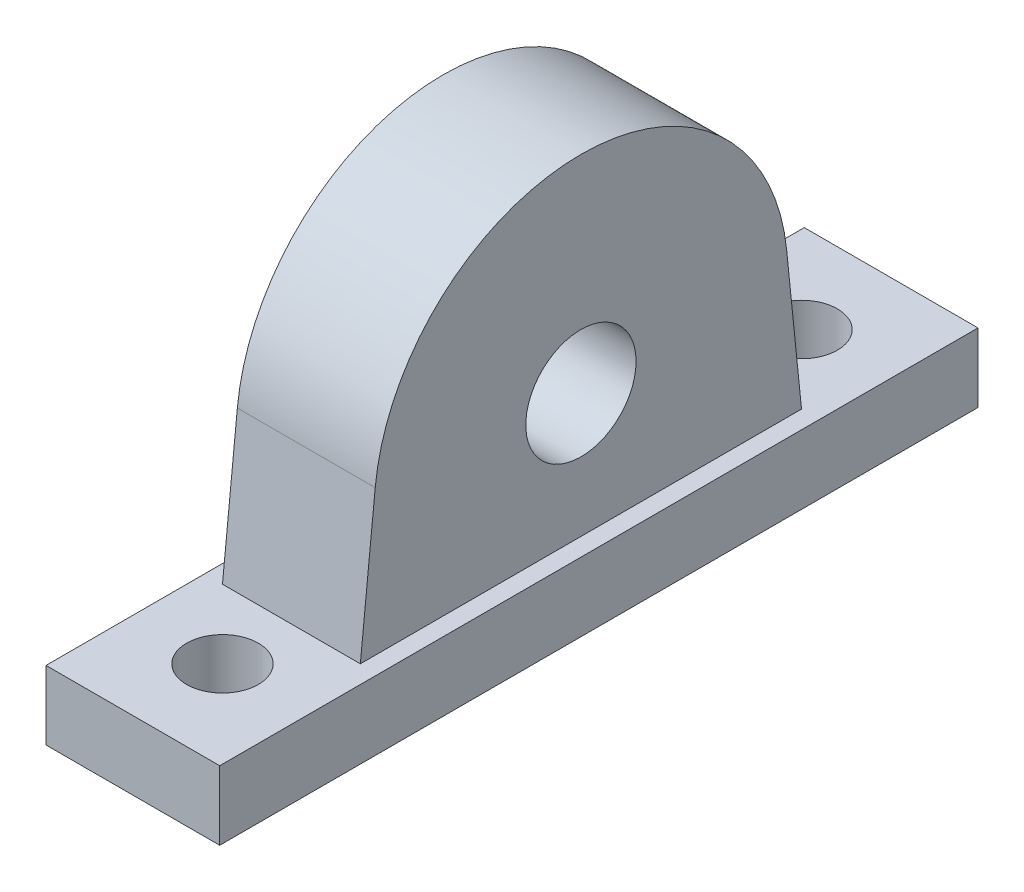
ISO-10303-21;
HEADER;
FILE_DESCRIPTION(('STEP AP214'),'2;1');
FILE_NAME('part.step','',(''),(''),'','','');
FILE_SCHEMA(('AUTOMOTIVE_DESIGN { 1 0 10303 214 1 1 1 1 }'));
ENDSEC;
DATA;
#1=APPLICATION_CONTEXT('core data for automotive mechanical design processes');
#2=APPLICATION_PROTOCOL_DEFINITION('international standard','automotive_design',2000,#1);
#3=PRODUCT_CONTEXT('',#1,'mechanical');
#4=PRODUCT('Part','Part','',(#3));
#5=PRODUCT_RELATED_PRODUCT_CATEGORY('part','',(#4));
#6=PRODUCT_DEFINITION_FORMATION('','',#4);
#7=PRODUCT_DEFINITION_CONTEXT('part definition',#1,'design');
#8=PRODUCT_DEFINITION('design','',#6,#7);
#9=PRODUCT_DEFINITION_SHAPE('','',#8);
#10=(LENGTH_UNIT() NAMED_UNIT(*) SI_UNIT(.MILLI.,.METRE.));
#11=(NAMED_UNIT(*) PLANE_ANGLE_UNIT() SI_UNIT($,.RADIAN.));
#12=(NAMED_UNIT(*) SI_UNIT($,.STERADIAN.) SOLID_ANGLE_UNIT());
#13=UNCERTAINTY_MEASURE_WITH_UNIT(LENGTH_MEASURE(1.E-05),#10,'distance_accuracy_value','');
#14=(GEOMETRIC_REPRESENTATION_CONTEXT(3) GLOBAL_UNCERTAINTY_ASSIGNED_CONTEXT((#13)) GLOBAL_UNIT_ASSIGNED_CONTEXT((#10,
#11,#12)) REPRESENTATION_CONTEXT('',''));
#15=CARTESIAN_POINT('',(0.,0.,0.));
#16=DIRECTION('',(0.,0.,1.));
#17=DIRECTION('',(1.,0.,0.));
#18=AXIS2_PLACEMENT_3D('',#15,#16,#17);
#19=CARTESIAN_POINT('',(0.,5.,0.));
#20=DIRECTION('',(0.,-1.,0.));
#21=DIRECTION('',(0.,0.,-1.));
#22=AXIS2_PLACEMENT_3D('',#19,#20,#21);
#23=PLANE('',#22);
#24=DIRECTION('',(-1.,0.,0.));
#25=VECTOR('',#24,1.);
#26=CARTESIAN_POINT('',(5.,5.,16.));
#27=LINE('',#26,#25);
#28=CARTESIAN_POINT('',(5.,5.,16.));
#29=VERTEX_POINT('',#28);
#30=CARTESIAN_POINT('',(-5.,5.,16.));
#31=VERTEX_POINT('',#30);
#32=EDGE_CURVE('E269',#29,#31,#27,.T.);
#33=ORIENTED_EDGE('',*,*,#32,.T.);
#34=DIRECTION('',(0.,0.,-1.));
#35=VECTOR('',#34,1.);
#36=CARTESIAN_POINT('',(-5.,5.,16.));
#37=LINE('',#36,#35);
#38=CARTESIAN_POINT('',(-5.,5.,-16.));
#39=VERTEX_POINT('',#38);
#40=EDGE_CURVE('E60',#31,#39,#37,.T.);
#41=ORIENTED_EDGE('',*,*,#40,.T.);
#42=DIRECTION('',(-1.,0.,0.));
#43=VECTOR('',#42,1.);
#44=CARTESIAN_POINT('',(5.,5.,-16.));
#45=LINE('',#44,#43);
#46=CARTESIAN_POINT('',(5.,5.,-16.));
#47=VERTEX_POINT('',#46);
#48=EDGE_CURVE('E124',#47,#39,#45,.T.);
#49=ORIENTED_EDGE('',*,*,#48,.F.);
#50=DIRECTION('',(0.,0.,-1.));
#51=VECTOR('',#50,1.);
#52=CARTESIAN_POINT('',(5.,5.,16.));
#53=LINE('',#52,#51);
#54=EDGE_CURVE('E131',#29,#47,#53,.T.);
#55=ORIENTED_EDGE('',*,*,#54,.F.);
#56=EDGE_LOOP('',(#33,#41,#49,#55));
#57=FACE_BOUND('',#56,.T.);
#58=DIRECTION('',(0.,0.,-1.));
#59=VECTOR('',#58,1.);
#60=CARTESIAN_POINT('',(6.3,5.,27.5));
#61=LINE('',#60,#59);
#62=CARTESIAN_POINT('',(6.3,5.,27.5));
#63=VERTEX_POINT('',#62);
#64=CARTESIAN_POINT('',(6.3,5.,-27.5));
#65=VERTEX_POINT('',#64);
#66=EDGE_CURVE('E168',#63,#65,#61,.T.);
#67=ORIENTED_EDGE('',*,*,#66,.T.);
#68=DIRECTION('',(-1.,0.,0.));
#69=VECTOR('',#68,1.);
#70=CARTESIAN_POINT('',(-6.3,5.,-27.5));
#71=LINE('',#70,#69);
#72=CARTESIAN_POINT('',(-6.3,5.,-27.5));
#73=VERTEX_POINT('',#72);
#74=EDGE_CURVE('E97',#65,#73,#71,.T.);
#75=ORIENTED_EDGE('',*,*,#74,.T.);
#76=DIRECTION('',(0.,0.,1.));
#77=VECTOR('',#76,1.);
#78=CARTESIAN_POINT('',(-6.3,5.,27.5));
#79=LINE('',#78,#77);
#80=CARTESIAN_POINT('',(-6.3,5.,27.5));
#81=VERTEX_POINT('',#80);
#82=EDGE_CURVE('E173',#73,#81,#79,.T.);
#83=ORIENTED_EDGE('',*,*,#82,.T.);
#84=DIRECTION('',(1.,0.,0.));
#85=VECTOR('',#84,1.);
#86=CARTESIAN_POINT('',(-6.3,5.,27.5));
#87=LINE('',#86,#85);
#88=EDGE_CURVE('E69',#81,#63,#87,.T.);
#89=ORIENTED_EDGE('',*,*,#88,.T.);
#90=EDGE_LOOP('',(#67,#75,#83,#89));
#91=FACE_BOUND('',#90,.T.);
#92=CARTESIAN_POINT('',(0.,5.,-21.));
#93=DIRECTION('',(0.,1.,0.));
#94=DIRECTION('',(0.,0.,1.));
#95=AXIS2_PLACEMENT_3D('',#92,#93,#94);
#96=CIRCLE('',#95,2.6);
#97=CARTESIAN_POINT('',(0.,5.,-18.4));
#98=VERTEX_POINT('',#97);
#99=EDGE_CURVE('E160',#98,#98,#96,.T.);
#100=ORIENTED_EDGE('',*,*,#99,.F.);
#101=EDGE_LOOP('',(#100));
#102=FACE_BOUND('',#101,.T.);
#103=CARTESIAN_POINT('',(0.,5.,21.));
#104=DIRECTION('',(0.,1.,0.));
#105=DIRECTION('',(0.,0.,1.));
#106=AXIS2_PLACEMENT_3D('',#103,#104,#105);
#107=CIRCLE('',#106,2.6);
#108=CARTESIAN_POINT('',(0.,5.,23.6));
#109=VERTEX_POINT('',#108);
#110=EDGE_CURVE('E150',#109,#109,#107,.T.);
#111=ORIENTED_EDGE('',*,*,#110,.F.);
#112=EDGE_LOOP('',(#111));
#113=FACE_BOUND('',#112,.T.);
#114=ADVANCED_FACE('F44',(#57,#91,#102,#113),#23,.F.);
#115=CARTESIAN_POINT('',(0.,0.,0.));
#116=DIRECTION('',(0.,-1.,0.));
#117=DIRECTION('',(0.,0.,-1.));
#118=AXIS2_PLACEMENT_3D('',#115,#116,#117);
#119=PLANE('',#118);
#120=CARTESIAN_POINT('',(0.,0.,-21.));
#121=DIRECTION('',(0.,1.,0.));
#122=DIRECTION('',(0.,0.,1.));
#123=AXIS2_PLACEMENT_3D('',#120,#121,#122);
#124=CIRCLE('',#123,2.6);
#125=CARTESIAN_POINT('',(0.,0.,-18.4));
#126=VERTEX_POINT('',#125);
#127=EDGE_CURVE('E158',#126,#126,#124,.T.);
#128=ORIENTED_EDGE('',*,*,#127,.T.);
#129=EDGE_LOOP('',(#128));
#130=FACE_BOUND('',#129,.T.);
#131=DIRECTION('',(0.,0.,-1.));
#132=VECTOR('',#131,1.);
#133=CARTESIAN_POINT('',(6.3,0.,27.5));
#134=LINE('',#133,#132);
#135=CARTESIAN_POINT('',(6.3,0.,27.5));
#136=VERTEX_POINT('',#135);
#137=CARTESIAN_POINT('',(6.3,0.,-27.5));
#138=VERTEX_POINT('',#137);
#139=EDGE_CURVE('E164',#136,#138,#134,.T.);
#140=ORIENTED_EDGE('',*,*,#139,.F.);
#141=DIRECTION('',(1.,0.,0.));
#142=VECTOR('',#141,1.);
#143=CARTESIAN_POINT('',(-6.3,0.,27.5));
#144=LINE('',#143,#142);
#145=CARTESIAN_POINT('',(-6.3,0.,27.5));
#146=VERTEX_POINT('',#145);
#147=EDGE_CURVE('E90',#146,#136,#144,.T.);
#148=ORIENTED_EDGE('',*,*,#147,.F.);
#149=DIRECTION('',(0.,0.,1.));
#150=VECTOR('',#149,1.);
#151=CARTESIAN_POINT('',(-6.3,0.,27.5));
#152=LINE('',#151,#150);
#153=CARTESIAN_POINT('',(-6.3,0.,-27.5));
#154=VERTEX_POINT('',#153);
#155=EDGE_CURVE('E185',#154,#146,#152,.T.);
#156=ORIENTED_EDGE('',*,*,#155,.F.);
#157=DIRECTION('',(-1.,0.,0.));
#158=VECTOR('',#157,1.);
#159=CARTESIAN_POINT('',(-6.3,0.,-27.5));
#160=LINE('',#159,#158);
#161=EDGE_CURVE('E182',#138,#154,#160,.T.);
#162=ORIENTED_EDGE('',*,*,#161,.F.);
#163=EDGE_LOOP('',(#140,#148,#156,#162));
#164=FACE_BOUND('',#163,.T.);
#165=CARTESIAN_POINT('',(0.,0.,21.));
#166=DIRECTION('',(0.,1.,0.));
#167=DIRECTION('',(0.,0.,1.));
#168=AXIS2_PLACEMENT_3D('',#165,#166,#167);
#169=CIRCLE('',#168,2.6);
#170=CARTESIAN_POINT('',(0.,0.,23.6));
#171=VERTEX_POINT('',#170);
#172=EDGE_CURVE('E145',#171,#171,#169,.T.);
#173=ORIENTED_EDGE('',*,*,#172,.T.);
#174=EDGE_LOOP('',(#173));
#175=FACE_BOUND('',#174,.T.);
#176=ADVANCED_FACE('F203',(#130,#164,#175),#119,.T.);
#177=CARTESIAN_POINT('',(6.3,5.,27.5));
#178=DIRECTION('',(-1.,0.,0.));
#179=DIRECTION('',(0.,0.,1.));
#180=AXIS2_PLACEMENT_3D('',#177,#178,#179);
#181=PLANE('',#180);
#182=ORIENTED_EDGE('',*,*,#139,.T.);
#183=DIRECTION('',(0.,-1.,0.));
#184=VECTOR('',#183,1.);
#185=CARTESIAN_POINT('',(6.3,5.,-27.5));
#186=LINE('',#185,#184);
#187=EDGE_CURVE('E11',#65,#138,#186,.T.);
#188=ORIENTED_EDGE('',*,*,#187,.F.);
#189=ORIENTED_EDGE('',*,*,#66,.F.);
#190=DIRECTION('',(0.,-1.,0.));
#191=VECTOR('',#190,1.);
#192=CARTESIAN_POINT('',(6.3,5.,27.5));
#193=LINE('',#192,#191);
#194=EDGE_CURVE('E178',#63,#136,#193,.T.);
#195=ORIENTED_EDGE('',*,*,#194,.T.);
#196=EDGE_LOOP('',(#182,#188,#189,#195));
#197=FACE_BOUND('',#196,.T.);
#198=ADVANCED_FACE('F46',(#197),#181,.F.);
#199=CARTESIAN_POINT('',(-6.3,5.,-27.5));
#200=DIRECTION('',(0.,0.,1.));
#201=DIRECTION('',(1.,0.,0.));
#202=AXIS2_PLACEMENT_3D('',#199,#200,#201);
#203=PLANE('',#202);
#204=ORIENTED_EDGE('',*,*,#161,.T.);
#205=DIRECTION('',(0.,-1.,0.));
#206=VECTOR('',#205,1.);
#207=CARTESIAN_POINT('',(-6.3,5.,-27.5));
#208=LINE('',#207,#206);
#209=EDGE_CURVE('E53',#73,#154,#208,.T.);
#210=ORIENTED_EDGE('',*,*,#209,.F.);
#211=ORIENTED_EDGE('',*,*,#74,.F.);
#212=ORIENTED_EDGE('',*,*,#187,.T.);
#213=EDGE_LOOP('',(#204,#210,#211,#212));
#214=FACE_BOUND('',#213,.T.);
#215=ADVANCED_FACE('F219',(#214),#203,.F.);
#216=CARTESIAN_POINT('',(-6.3,5.,27.5));
#217=DIRECTION('',(1.,0.,0.));
#218=DIRECTION('',(0.,0.,-1.));
#219=AXIS2_PLACEMENT_3D('',#216,#217,#218);
#220=PLANE('',#219);
#221=ORIENTED_EDGE('',*,*,#155,.T.);
#222=DIRECTION('',(0.,-1.,0.));
#223=VECTOR('',#222,1.);
#224=CARTESIAN_POINT('',(-6.3,5.,27.5));
#225=LINE('',#224,#223);
#226=EDGE_CURVE('E192',#81,#146,#225,.T.);
#227=ORIENTED_EDGE('',*,*,#226,.F.);
#228=ORIENTED_EDGE('',*,*,#82,.F.);
#229=ORIENTED_EDGE('',*,*,#209,.T.);
#230=EDGE_LOOP('',(#221,#227,#228,#229));
#231=FACE_BOUND('',#230,.T.);
#232=ADVANCED_FACE('F199',(#231),#220,.F.);
#233=CARTESIAN_POINT('',(-6.3,5.,27.5));
#234=DIRECTION('',(0.,0.,-1.));
#235=DIRECTION('',(-1.,0.,0.));
#236=AXIS2_PLACEMENT_3D('',#233,#234,#235);
#237=PLANE('',#236);
#238=ORIENTED_EDGE('',*,*,#147,.T.);
#239=ORIENTED_EDGE('',*,*,#194,.F.);
#240=ORIENTED_EDGE('',*,*,#88,.F.);
#241=ORIENTED_EDGE('',*,*,#226,.T.);
#242=EDGE_LOOP('',(#238,#239,#240,#241));
#243=FACE_BOUND('',#242,.T.);
#244=ADVANCED_FACE('F208',(#243),#237,.F.);
#245=CARTESIAN_POINT('',(0.,5.,-21.));
#246=DIRECTION('',(0.,-1.,0.));
#247=DIRECTION('',(0.,0.,-1.));
#248=AXIS2_PLACEMENT_3D('',#245,#246,#247);
#249=CYLINDRICAL_SURFACE('',#248,2.6);
#250=ORIENTED_EDGE('',*,*,#99,.T.);
#251=EDGE_LOOP('',(#250));
#252=FACE_BOUND('',#251,.T.);
#253=ORIENTED_EDGE('',*,*,#127,.F.);
#254=EDGE_LOOP('',(#253));
#255=FACE_BOUND('',#254,.T.);
#256=ADVANCED_FACE('F210',(#252,#255),#249,.F.);
#257=CARTESIAN_POINT('',(0.,5.,21.));
#258=DIRECTION('',(0.,-1.,0.));
#259=DIRECTION('',(0.,0.,-1.));
#260=AXIS2_PLACEMENT_3D('',#257,#258,#259);
#261=CYLINDRICAL_SURFACE('',#260,2.6);
#262=ORIENTED_EDGE('',*,*,#110,.T.);
#263=EDGE_LOOP('',(#262));
#264=FACE_BOUND('',#263,.T.);
#265=ORIENTED_EDGE('',*,*,#172,.F.);
#266=EDGE_LOOP('',(#265));
#267=FACE_BOUND('',#266,.T.);
#268=ADVANCED_FACE('F216',(#264,#267),#261,.F.);
#269=CARTESIAN_POINT('',(5.,14.,0.));
#270=DIRECTION('',(-1.,0.,0.));
#271=DIRECTION('',(0.,0.,1.));
#272=AXIS2_PLACEMENT_3D('',#269,#270,#271);
#273=PLANE('',#272);
#274=ORIENTED_EDGE('',*,*,#54,.T.);
#275=DIRECTION('',(0.,0.994798359638947,0.101863750469239));
#276=VECTOR('',#275,1.);
#277=CARTESIAN_POINT('',(5.,15.5279562570386,-14.9219753945842));
#278=LINE('',#277,#276);
#279=CARTESIAN_POINT('',(5.,15.5279562570386,-14.9219753945842));
#280=VERTEX_POINT('',#279);
#281=EDGE_CURVE('E120',#47,#280,#278,.T.);
#282=ORIENTED_EDGE('',*,*,#281,.T.);
#283=CARTESIAN_POINT('',(5.,14.,0.));
#284=DIRECTION('',(1.,0.,0.));
#285=DIRECTION('',(0.,0.,1.));
#286=AXIS2_PLACEMENT_3D('',#283,#284,#285);
#287=CIRCLE('',#286,15.);
#288=CARTESIAN_POINT('',(5.,15.5279562570386,14.9219753945842));
#289=VERTEX_POINT('',#288);
#290=EDGE_CURVE('E130',#280,#289,#287,.T.);
#291=ORIENTED_EDGE('',*,*,#290,.T.);
#292=DIRECTION('',(0.,-0.994798359638947,0.101863750469239));
#293=VECTOR('',#292,1.);
#294=CARTESIAN_POINT('',(5.,5.,16.));
#295=LINE('',#294,#293);
#296=EDGE_CURVE('E137',#289,#29,#295,.T.);
#297=ORIENTED_EDGE('',*,*,#296,.T.);
#298=EDGE_LOOP('',(#274,#282,#291,#297));
#299=FACE_BOUND('',#298,.T.);
#300=CARTESIAN_POINT('',(5.,14.,0.));
#301=DIRECTION('',(1.,0.,0.));
#302=DIRECTION('',(0.,0.,-1.));
#303=AXIS2_PLACEMENT_3D('',#300,#301,#302);
#304=CIRCLE('',#303,4.);
#305=CARTESIAN_POINT('',(5.,14.,-4.));
#306=VERTEX_POINT('',#305);
#307=EDGE_CURVE('E255',#306,#306,#304,.T.);
#308=ORIENTED_EDGE('',*,*,#307,.F.);
#309=EDGE_LOOP('',(#308));
#310=FACE_BOUND('',#309,.T.);
#311=ADVANCED_FACE('F134',(#299,#310),#273,.F.);
#312=CARTESIAN_POINT('',(-5.,14.,0.));
#313=DIRECTION('',(-1.,0.,0.));
#314=DIRECTION('',(0.,0.,1.));
#315=AXIS2_PLACEMENT_3D('',#312,#313,#314);
#316=PLANE('',#315);
#317=ORIENTED_EDGE('',*,*,#40,.F.);
#318=DIRECTION('',(0.,-0.994798359638947,0.101863750469239));
#319=VECTOR('',#318,1.);
#320=CARTESIAN_POINT('',(-5.,5.,16.));
#321=LINE('',#320,#319);
#322=CARTESIAN_POINT('',(-5.,15.5279562570386,14.9219753945842));
#323=VERTEX_POINT('',#322);
#324=EDGE_CURVE('E142',#323,#31,#321,.T.);
#325=ORIENTED_EDGE('',*,*,#324,.F.);
#326=CARTESIAN_POINT('',(-5.,14.,0.));
#327=DIRECTION('',(1.,0.,0.));
#328=DIRECTION('',(0.,0.,1.));
#329=AXIS2_PLACEMENT_3D('',#326,#327,#328);
#330=CIRCLE('',#329,15.);
#331=CARTESIAN_POINT('',(-5.,15.5279562570386,-14.9219753945842));
#332=VERTEX_POINT('',#331);
#333=EDGE_CURVE('E275',#332,#323,#330,.T.);
#334=ORIENTED_EDGE('',*,*,#333,.F.);
#335=DIRECTION('',(0.,0.994798359638947,0.101863750469239));
#336=VECTOR('',#335,1.);
#337=CARTESIAN_POINT('',(-5.,15.5279562570386,-14.9219753945842));
#338=LINE('',#337,#336);
#339=EDGE_CURVE('E272',#39,#332,#338,.T.);
#340=ORIENTED_EDGE('',*,*,#339,.F.);
#341=EDGE_LOOP('',(#317,#325,#334,#340));
#342=FACE_BOUND('',#341,.T.);
#343=CARTESIAN_POINT('',(-5.,14.,0.));
#344=DIRECTION('',(1.,0.,0.));
#345=DIRECTION('',(0.,0.,-1.));
#346=AXIS2_PLACEMENT_3D('',#343,#344,#345);
#347=CIRCLE('',#346,4.);
#348=CARTESIAN_POINT('',(-5.,14.,-4.));
#349=VERTEX_POINT('',#348);
#350=EDGE_CURVE('E258',#349,#349,#347,.T.);
#351=ORIENTED_EDGE('',*,*,#350,.T.);
#352=EDGE_LOOP('',(#351));
#353=FACE_BOUND('',#352,.T.);
#354=ADVANCED_FACE('F236',(#342,#353),#316,.T.);
#355=CARTESIAN_POINT('',(5.,15.5279562570386,-14.9219753945842));
#356=DIRECTION('',(0.,-0.101863750469239,0.994798359638947));
#357=DIRECTION('',(0.,-0.994798359638947,-0.101863750469239));
#358=AXIS2_PLACEMENT_3D('',#355,#356,#357);
#359=PLANE('',#358);
#360=ORIENTED_EDGE('',*,*,#339,.T.);
#361=DIRECTION('',(-1.,0.,0.));
#362=VECTOR('',#361,1.);
#363=CARTESIAN_POINT('',(5.,15.5279562570386,-14.9219753945842));
#364=LINE('',#363,#362);
#365=EDGE_CURVE('E126',#280,#332,#364,.T.);
#366=ORIENTED_EDGE('',*,*,#365,.F.);
#367=ORIENTED_EDGE('',*,*,#281,.F.);
#368=ORIENTED_EDGE('',*,*,#48,.T.);
#369=EDGE_LOOP('',(#360,#366,#367,#368));
#370=FACE_BOUND('',#369,.T.);
#371=ADVANCED_FACE('F122',(#370),#359,.F.);
#372=CARTESIAN_POINT('',(5.,14.,0.));
#373=DIRECTION('',(-1.,0.,0.));
#374=DIRECTION('',(0.,0.,1.));
#375=AXIS2_PLACEMENT_3D('',#372,#373,#374);
#376=CYLINDRICAL_SURFACE('',#375,15.);
#377=ORIENTED_EDGE('',*,*,#333,.T.);
#378=DIRECTION('',(-1.,0.,0.));
#379=VECTOR('',#378,1.);
#380=CARTESIAN_POINT('',(5.,15.5279562570386,14.9219753945842));
#381=LINE('',#380,#379);
#382=EDGE_CURVE('E152',#289,#323,#381,.T.);
#383=ORIENTED_EDGE('',*,*,#382,.F.);
#384=ORIENTED_EDGE('',*,*,#290,.F.);
#385=ORIENTED_EDGE('',*,*,#365,.T.);
#386=EDGE_LOOP('',(#377,#383,#384,#385));
#387=FACE_BOUND('',#386,.T.);
#388=ADVANCED_FACE('F235',(#387),#376,.T.);
#389=CARTESIAN_POINT('',(5.,5.,16.));
#390=DIRECTION('',(0.,-0.101863750469239,-0.994798359638947));
#391=DIRECTION('',(0.,0.994798359638947,-0.101863750469239));
#392=AXIS2_PLACEMENT_3D('',#389,#390,#391);
#393=PLANE('',#392);
#394=ORIENTED_EDGE('',*,*,#324,.T.);
#395=ORIENTED_EDGE('',*,*,#32,.F.);
#396=ORIENTED_EDGE('',*,*,#296,.F.);
#397=ORIENTED_EDGE('',*,*,#382,.T.);
#398=EDGE_LOOP('',(#394,#395,#396,#397));
#399=FACE_BOUND('',#398,.T.);
#400=ADVANCED_FACE('F239',(#399),#393,.F.);
#401=CARTESIAN_POINT('',(5.,14.,0.));
#402=DIRECTION('',(-1.,0.,0.));
#403=DIRECTION('',(0.,0.,1.));
#404=AXIS2_PLACEMENT_3D('',#401,#402,#403);
#405=CYLINDRICAL_SURFACE('',#404,4.);
#406=ORIENTED_EDGE('',*,*,#307,.T.);
#407=EDGE_LOOP('',(#406));
#408=FACE_BOUND('',#407,.T.);
#409=ORIENTED_EDGE('',*,*,#350,.F.);
#410=EDGE_LOOP('',(#409));
#411=FACE_BOUND('',#410,.T.);
#412=ADVANCED_FACE('F243',(#408,#411),#405,.F.);
#413=CLOSED_SHELL('',(#114,#176,#198,#215,#232,#244,#256,#268,#311,#354,#371,#388,#400,#412));
#414=MANIFOLD_SOLID_BREP('B2',#413);
#415=ADVANCED_BREP_SHAPE_REPRESENTATION('',(#18,#414),#14);
#416=SHAPE_DEFINITION_REPRESENTATION(#9,#415);
ENDSEC;
END-ISO-10303-21;
